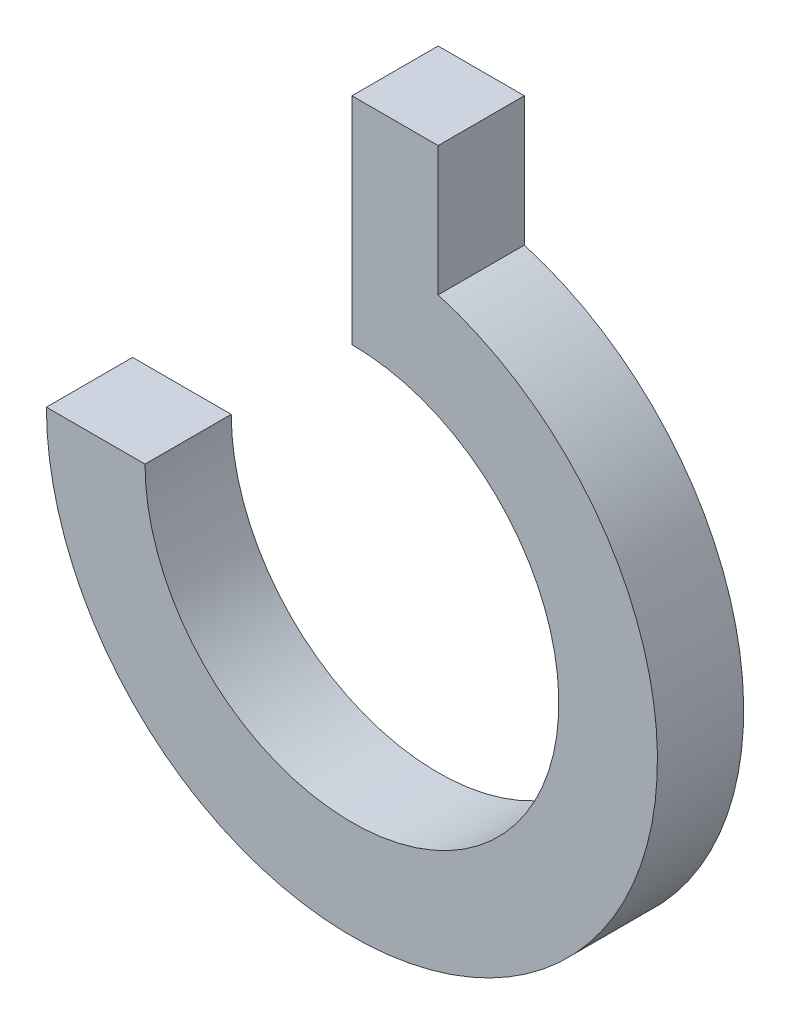
ISO-10303-21;
HEADER;
FILE_DESCRIPTION(('STEP AP214'),'2;1');
FILE_NAME('part.step','',(''),(''),'','','');
FILE_SCHEMA(('AUTOMOTIVE_DESIGN { 1 0 10303 214 1 1 1 1 }'));
ENDSEC;
DATA;
#1=APPLICATION_CONTEXT('core data for automotive mechanical design processes');
#2=APPLICATION_PROTOCOL_DEFINITION('international standard','automotive_design',2000,#1);
#3=PRODUCT_CONTEXT('',#1,'mechanical');
#4=PRODUCT('Part','Part','',(#3));
#5=PRODUCT_RELATED_PRODUCT_CATEGORY('part','',(#4));
#6=PRODUCT_DEFINITION_FORMATION('','',#4);
#7=PRODUCT_DEFINITION_CONTEXT('part definition',#1,'design');
#8=PRODUCT_DEFINITION('design','',#6,#7);
#9=PRODUCT_DEFINITION_SHAPE('','',#8);
#10=(LENGTH_UNIT() NAMED_UNIT(*) SI_UNIT(.MILLI.,.METRE.));
#11=(NAMED_UNIT(*) PLANE_ANGLE_UNIT() SI_UNIT($,.RADIAN.));
#12=(NAMED_UNIT(*) SI_UNIT($,.STERADIAN.) SOLID_ANGLE_UNIT());
#13=UNCERTAINTY_MEASURE_WITH_UNIT(LENGTH_MEASURE(1.E-05),#10,'distance_accuracy_value','');
#14=(GEOMETRIC_REPRESENTATION_CONTEXT(3) GLOBAL_UNCERTAINTY_ASSIGNED_CONTEXT((#13)) GLOBAL_UNIT_ASSIGNED_CONTEXT((#10,
#11,#12)) REPRESENTATION_CONTEXT('',''));
#15=CARTESIAN_POINT('',(0.,0.,0.));
#16=DIRECTION('',(0.,0.,1.));
#17=DIRECTION('',(1.,0.,0.));
#18=AXIS2_PLACEMENT_3D('',#15,#16,#17);
#19=CARTESIAN_POINT('',(0.,-182.5,50.));
#20=DIRECTION('',(0.,0.,-1.));
#21=DIRECTION('',(-1.,0.,0.));
#22=AXIS2_PLACEMENT_3D('',#19,#20,#21);
#23=CYLINDRICAL_SURFACE('',#22,177.200451466693);
#24=CARTESIAN_POINT('',(0.,-182.5,0.));
#25=DIRECTION('',(0.,0.,1.));
#26=DIRECTION('',(1.,0.,0.));
#27=AXIS2_PLACEMENT_3D('',#24,#25,#26);
#28=CIRCLE('',#27,177.200451466693);
#29=CARTESIAN_POINT('',(-177.200451466693,-182.5,0.));
#30=VERTEX_POINT('',#29);
#31=CARTESIAN_POINT('',(50.,-12.5,0.));
#32=VERTEX_POINT('',#31);
#33=EDGE_CURVE('E123',#30,#32,#28,.T.);
#34=ORIENTED_EDGE('',*,*,#33,.T.);
#35=DIRECTION('',(0.,0.,-1.));
#36=VECTOR('',#35,1.);
#37=CARTESIAN_POINT('',(50.,-12.5,50.));
#38=LINE('',#37,#36);
#39=CARTESIAN_POINT('',(50.,-12.5,50.));
#40=VERTEX_POINT('',#39);
#41=EDGE_CURVE('E11',#40,#32,#38,.T.);
#42=ORIENTED_EDGE('',*,*,#41,.F.);
#43=CARTESIAN_POINT('',(0.,-182.5,50.));
#44=DIRECTION('',(0.,0.,1.));
#45=DIRECTION('',(1.,0.,0.));
#46=AXIS2_PLACEMENT_3D('',#43,#44,#45);
#47=CIRCLE('',#46,177.200451466693);
#48=CARTESIAN_POINT('',(-177.200451466693,-182.5,50.));
#49=VERTEX_POINT('',#48);
#50=EDGE_CURVE('E133',#49,#40,#47,.T.);
#51=ORIENTED_EDGE('',*,*,#50,.F.);
#52=DIRECTION('',(0.,0.,-1.));
#53=VECTOR('',#52,1.);
#54=CARTESIAN_POINT('',(-177.200451466693,-182.5,50.));
#55=LINE('',#54,#53);
#56=EDGE_CURVE('E119',#49,#30,#55,.T.);
#57=ORIENTED_EDGE('',*,*,#56,.T.);
#58=EDGE_LOOP('',(#34,#42,#51,#57));
#59=FACE_BOUND('',#58,.T.);
#60=ADVANCED_FACE('F39',(#59),#23,.T.);
#61=CARTESIAN_POINT('',(50.,62.5,50.));
#62=DIRECTION('',(-1.,0.,0.));
#63=DIRECTION('',(0.,-1.,0.));
#64=AXIS2_PLACEMENT_3D('',#61,#62,#63);
#65=PLANE('',#64);
#66=DIRECTION('',(0.,1.,0.));
#67=VECTOR('',#66,1.);
#68=CARTESIAN_POINT('',(50.,62.5,0.));
#69=LINE('',#68,#67);
#70=CARTESIAN_POINT('',(50.,62.5,0.));
#71=VERTEX_POINT('',#70);
#72=EDGE_CURVE('E126',#32,#71,#69,.T.);
#73=ORIENTED_EDGE('',*,*,#72,.T.);
#74=DIRECTION('',(0.,0.,-1.));
#75=VECTOR('',#74,1.);
#76=CARTESIAN_POINT('',(50.,62.5,50.));
#77=LINE('',#76,#75);
#78=CARTESIAN_POINT('',(50.,62.5,50.));
#79=VERTEX_POINT('',#78);
#80=EDGE_CURVE('E47',#79,#71,#77,.T.);
#81=ORIENTED_EDGE('',*,*,#80,.F.);
#82=DIRECTION('',(0.,1.,0.));
#83=VECTOR('',#82,1.);
#84=CARTESIAN_POINT('',(50.,62.5,50.));
#85=LINE('',#84,#83);
#86=EDGE_CURVE('E92',#40,#79,#85,.T.);
#87=ORIENTED_EDGE('',*,*,#86,.F.);
#88=ORIENTED_EDGE('',*,*,#41,.T.);
#89=EDGE_LOOP('',(#73,#81,#87,#88));
#90=FACE_BOUND('',#89,.T.);
#91=ADVANCED_FACE('F157',(#90),#65,.F.);
#92=CARTESIAN_POINT('',(0.,62.5,50.));
#93=DIRECTION('',(0.,-1.,0.));
#94=DIRECTION('',(0.,0.,-1.));
#95=AXIS2_PLACEMENT_3D('',#92,#93,#94);
#96=PLANE('',#95);
#97=DIRECTION('',(-1.,0.,0.));
#98=VECTOR('',#97,1.);
#99=CARTESIAN_POINT('',(0.,62.5,0.));
#100=LINE('',#99,#98);
#101=CARTESIAN_POINT('',(0.,62.5,0.));
#102=VERTEX_POINT('',#101);
#103=EDGE_CURVE('E128',#71,#102,#100,.T.);
#104=ORIENTED_EDGE('',*,*,#103,.T.);
#105=DIRECTION('',(0.,0.,-1.));
#106=VECTOR('',#105,1.);
#107=CARTESIAN_POINT('',(0.,62.5,50.));
#108=LINE('',#107,#106);
#109=CARTESIAN_POINT('',(0.,62.5,50.));
#110=VERTEX_POINT('',#109);
#111=EDGE_CURVE('E114',#110,#102,#108,.T.);
#112=ORIENTED_EDGE('',*,*,#111,.F.);
#113=DIRECTION('',(-1.,0.,0.));
#114=VECTOR('',#113,1.);
#115=CARTESIAN_POINT('',(0.,62.5,50.));
#116=LINE('',#115,#114);
#117=EDGE_CURVE('E105',#79,#110,#116,.T.);
#118=ORIENTED_EDGE('',*,*,#117,.F.);
#119=ORIENTED_EDGE('',*,*,#80,.T.);
#120=EDGE_LOOP('',(#104,#112,#118,#119));
#121=FACE_BOUND('',#120,.T.);
#122=ADVANCED_FACE('F139',(#121),#96,.F.);
#123=CARTESIAN_POINT('',(0.,62.5,50.));
#124=DIRECTION('',(1.,0.,0.));
#125=DIRECTION('',(0.,1.,0.));
#126=AXIS2_PLACEMENT_3D('',#123,#124,#125);
#127=PLANE('',#126);
#128=DIRECTION('',(0.,-1.,0.));
#129=VECTOR('',#128,1.);
#130=CARTESIAN_POINT('',(0.,62.5,0.));
#131=LINE('',#130,#129);
#132=CARTESIAN_POINT('',(0.,-62.5,0.));
#133=VERTEX_POINT('',#132);
#134=EDGE_CURVE('E113',#102,#133,#131,.T.);
#135=ORIENTED_EDGE('',*,*,#134,.T.);
#136=DIRECTION('',(0.,0.,-1.));
#137=VECTOR('',#136,1.);
#138=CARTESIAN_POINT('',(0.,-62.5,50.));
#139=LINE('',#138,#137);
#140=CARTESIAN_POINT('',(0.,-62.5,50.));
#141=VERTEX_POINT('',#140);
#142=EDGE_CURVE('E110',#141,#133,#139,.T.);
#143=ORIENTED_EDGE('',*,*,#142,.F.);
#144=DIRECTION('',(0.,-1.,0.));
#145=VECTOR('',#144,1.);
#146=CARTESIAN_POINT('',(0.,62.5,50.));
#147=LINE('',#146,#145);
#148=EDGE_CURVE('E99',#110,#141,#147,.T.);
#149=ORIENTED_EDGE('',*,*,#148,.F.);
#150=ORIENTED_EDGE('',*,*,#111,.T.);
#151=EDGE_LOOP('',(#135,#143,#149,#150));
#152=FACE_BOUND('',#151,.T.);
#153=ADVANCED_FACE('F111',(#152),#127,.F.);
#154=CARTESIAN_POINT('',(0.,-182.5,50.));
#155=DIRECTION('',(0.,0.,-1.));
#156=DIRECTION('',(-1.,0.,0.));
#157=AXIS2_PLACEMENT_3D('',#154,#155,#156);
#158=CYLINDRICAL_SURFACE('',#157,120.);
#159=CARTESIAN_POINT('',(0.,-182.5,0.));
#160=DIRECTION('',(0.,0.,-1.));
#161=DIRECTION('',(1.,0.,0.));
#162=AXIS2_PLACEMENT_3D('',#159,#160,#161);
#163=CIRCLE('',#162,120.);
#164=CARTESIAN_POINT('',(-120.,-182.5,0.));
#165=VERTEX_POINT('',#164);
#166=EDGE_CURVE('E78',#133,#165,#163,.T.);
#167=ORIENTED_EDGE('',*,*,#166,.T.);
#168=DIRECTION('',(0.,0.,-1.));
#169=VECTOR('',#168,1.);
#170=CARTESIAN_POINT('',(-120.,-182.5,50.));
#171=LINE('',#170,#169);
#172=CARTESIAN_POINT('',(-120.,-182.5,50.));
#173=VERTEX_POINT('',#172);
#174=EDGE_CURVE('E115',#173,#165,#171,.T.);
#175=ORIENTED_EDGE('',*,*,#174,.F.);
#176=CARTESIAN_POINT('',(0.,-182.5,50.));
#177=DIRECTION('',(0.,0.,-1.));
#178=DIRECTION('',(1.,0.,0.));
#179=AXIS2_PLACEMENT_3D('',#176,#177,#178);
#180=CIRCLE('',#179,120.);
#181=EDGE_CURVE('E103',#141,#173,#180,.T.);
#182=ORIENTED_EDGE('',*,*,#181,.F.);
#183=ORIENTED_EDGE('',*,*,#142,.T.);
#184=EDGE_LOOP('',(#167,#175,#182,#183));
#185=FACE_BOUND('',#184,.T.);
#186=ADVANCED_FACE('F117',(#185),#158,.F.);
#187=CARTESIAN_POINT('',(-120.,-182.5,50.));
#188=DIRECTION('',(0.,-1.,0.));
#189=DIRECTION('',(0.,0.,-1.));
#190=AXIS2_PLACEMENT_3D('',#187,#188,#189);
#191=PLANE('',#190);
#192=DIRECTION('',(-1.,0.,0.));
#193=VECTOR('',#192,1.);
#194=CARTESIAN_POINT('',(-120.,-182.5,0.));
#195=LINE('',#194,#193);
#196=EDGE_CURVE('E84',#165,#30,#195,.T.);
#197=ORIENTED_EDGE('',*,*,#196,.T.);
#198=ORIENTED_EDGE('',*,*,#56,.F.);
#199=DIRECTION('',(-1.,0.,0.));
#200=VECTOR('',#199,1.);
#201=CARTESIAN_POINT('',(-120.,-182.5,50.));
#202=LINE('',#201,#200);
#203=EDGE_CURVE('E55',#173,#49,#202,.T.);
#204=ORIENTED_EDGE('',*,*,#203,.F.);
#205=ORIENTED_EDGE('',*,*,#174,.T.);
#206=EDGE_LOOP('',(#197,#198,#204,#205));
#207=FACE_BOUND('',#206,.T.);
#208=ADVANCED_FACE('F146',(#207),#191,.F.);
#209=CARTESIAN_POINT('',(0.,-182.5,50.));
#210=DIRECTION('',(0.,0.,1.));
#211=DIRECTION('',(1.,0.,0.));
#212=AXIS2_PLACEMENT_3D('',#209,#210,#211);
#213=PLANE('',#212);
#214=ORIENTED_EDGE('',*,*,#50,.T.);
#215=ORIENTED_EDGE('',*,*,#86,.T.);
#216=ORIENTED_EDGE('',*,*,#117,.T.);
#217=ORIENTED_EDGE('',*,*,#148,.T.);
#218=ORIENTED_EDGE('',*,*,#181,.T.);
#219=ORIENTED_EDGE('',*,*,#203,.T.);
#220=EDGE_LOOP('',(#214,#215,#216,#217,#218,#219));
#221=FACE_BOUND('',#220,.T.);
#222=ADVANCED_FACE('F101',(#221),#213,.T.);
#223=CARTESIAN_POINT('',(0.,-182.5,0.));
#224=DIRECTION('',(0.,0.,1.));
#225=DIRECTION('',(1.,0.,0.));
#226=AXIS2_PLACEMENT_3D('',#223,#224,#225);
#227=PLANE('',#226);
#228=ORIENTED_EDGE('',*,*,#33,.F.);
#229=ORIENTED_EDGE('',*,*,#196,.F.);
#230=ORIENTED_EDGE('',*,*,#166,.F.);
#231=ORIENTED_EDGE('',*,*,#134,.F.);
#232=ORIENTED_EDGE('',*,*,#103,.F.);
#233=ORIENTED_EDGE('',*,*,#72,.F.);
#234=EDGE_LOOP('',(#228,#229,#230,#231,#232,#233));
#235=FACE_BOUND('',#234,.T.);
#236=ADVANCED_FACE('F142',(#235),#227,.F.);
#237=CLOSED_SHELL('',(#60,#91,#122,#153,#186,#208,#222,#236));
#238=MANIFOLD_SOLID_BREP('B2',#237);
#239=ADVANCED_BREP_SHAPE_REPRESENTATION('',(#18,#238),#14);
#240=SHAPE_DEFINITION_REPRESENTATION(#9,#239);
ENDSEC;
END-ISO-10303-21;
